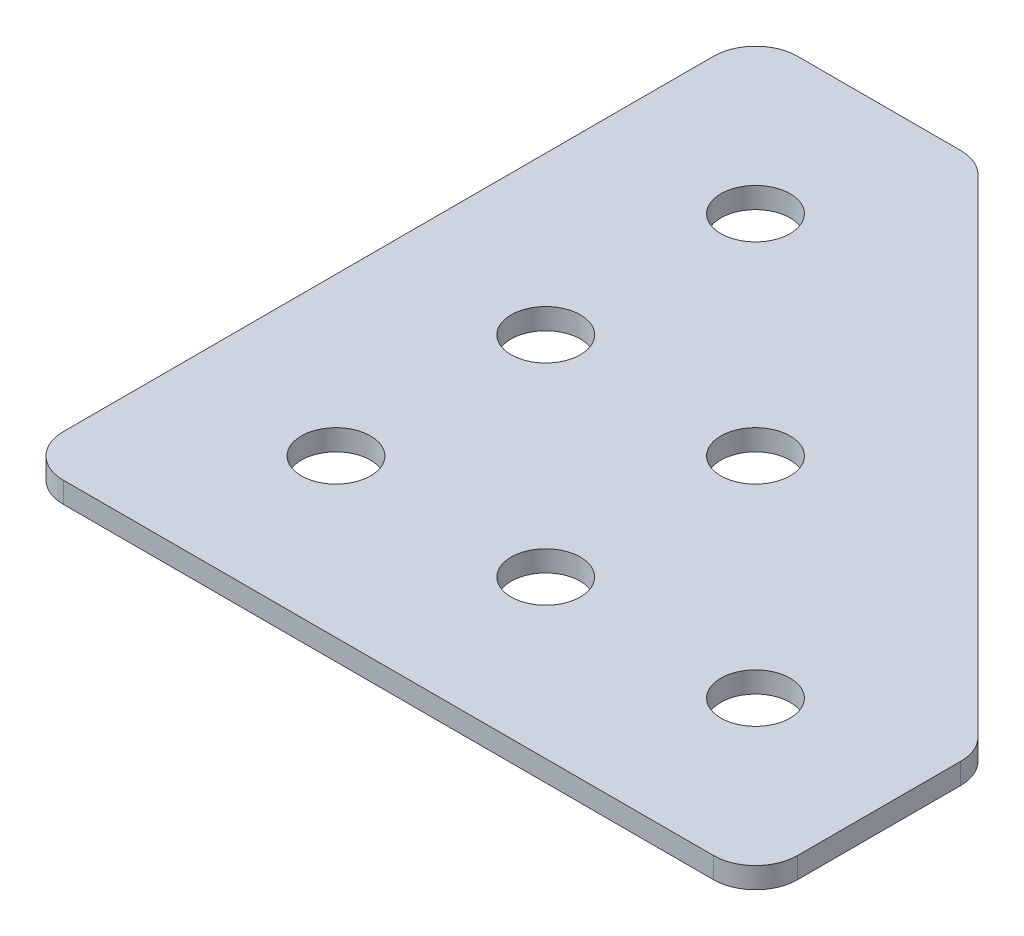
ISO-10303-21;
HEADER;
FILE_DESCRIPTION(('STEP AP214'),'2;1');
FILE_NAME('part.step','',(''),(''),'','','');
FILE_SCHEMA(('AUTOMOTIVE_DESIGN { 1 0 10303 214 1 1 1 1 }'));
ENDSEC;
DATA;
#1=APPLICATION_CONTEXT('core data for automotive mechanical design processes');
#2=APPLICATION_PROTOCOL_DEFINITION('international standard','automotive_design',2000,#1);
#3=PRODUCT_CONTEXT('',#1,'mechanical');
#4=PRODUCT('Part','Part','',(#3));
#5=PRODUCT_RELATED_PRODUCT_CATEGORY('part','',(#4));
#6=PRODUCT_DEFINITION_FORMATION('','',#4);
#7=PRODUCT_DEFINITION_CONTEXT('part definition',#1,'design');
#8=PRODUCT_DEFINITION('design','',#6,#7);
#9=PRODUCT_DEFINITION_SHAPE('','',#8);
#10=(LENGTH_UNIT() NAMED_UNIT(*) SI_UNIT(.MILLI.,.METRE.));
#11=(NAMED_UNIT(*) PLANE_ANGLE_UNIT() SI_UNIT($,.RADIAN.));
#12=(NAMED_UNIT(*) SI_UNIT($,.STERADIAN.) SOLID_ANGLE_UNIT());
#13=UNCERTAINTY_MEASURE_WITH_UNIT(LENGTH_MEASURE(1.E-05),#10,'distance_accuracy_value','');
#14=(GEOMETRIC_REPRESENTATION_CONTEXT(3) GLOBAL_UNCERTAINTY_ASSIGNED_CONTEXT((#13)) GLOBAL_UNIT_ASSIGNED_CONTEXT((#10,
#11,#12)) REPRESENTATION_CONTEXT('',''));
#15=CARTESIAN_POINT('',(0.,0.,0.));
#16=DIRECTION('',(0.,0.,1.));
#17=DIRECTION('',(1.,0.,0.));
#18=AXIS2_PLACEMENT_3D('',#15,#16,#17);
#19=CARTESIAN_POINT('',(33.,1.,-2.));
#20=DIRECTION('',(0.,1.,0.));
#21=DIRECTION('',(0.,0.,1.));
#22=AXIS2_PLACEMENT_3D('',#19,#20,#21);
#23=PLANE('',#22);
#24=CARTESIAN_POINT('',(7.5,1.,-17.5));
#25=DIRECTION('',(0.,1.,0.));
#26=DIRECTION('',(0.,0.,1.));
#27=AXIS2_PLACEMENT_3D('',#24,#25,#26);
#28=CIRCLE('',#27,1.65);
#29=CARTESIAN_POINT('',(7.5,1.,-15.85));
#30=VERTEX_POINT('',#29);
#31=EDGE_CURVE('E231',#30,#30,#28,.T.);
#32=ORIENTED_EDGE('',*,*,#31,.F.);
#33=EDGE_LOOP('',(#32));
#34=FACE_BOUND('',#33,.T.);
#35=CARTESIAN_POINT('',(17.5,1.,-7.5));
#36=DIRECTION('',(0.,1.,0.));
#37=DIRECTION('',(0.,0.,1.));
#38=AXIS2_PLACEMENT_3D('',#35,#36,#37);
#39=CIRCLE('',#38,1.65);
#40=CARTESIAN_POINT('',(17.5,1.,-5.85));
#41=VERTEX_POINT('',#40);
#42=EDGE_CURVE('E219',#41,#41,#39,.T.);
#43=ORIENTED_EDGE('',*,*,#42,.F.);
#44=EDGE_LOOP('',(#43));
#45=FACE_BOUND('',#44,.T.);
#46=CARTESIAN_POINT('',(7.5,1.,-7.49999999999999));
#47=DIRECTION('',(0.,1.,0.));
#48=DIRECTION('',(0.,0.,1.));
#49=AXIS2_PLACEMENT_3D('',#46,#47,#48);
#50=CIRCLE('',#49,1.65);
#51=CARTESIAN_POINT('',(7.5,1.,-5.84999999999999));
#52=VERTEX_POINT('',#51);
#53=EDGE_CURVE('E147',#52,#52,#50,.T.);
#54=ORIENTED_EDGE('',*,*,#53,.F.);
#55=EDGE_LOOP('',(#54));
#56=FACE_BOUND('',#55,.T.);
#57=CARTESIAN_POINT('',(33.,1.,-2.));
#58=DIRECTION('',(0.,1.,0.));
#59=DIRECTION('',(0.,0.,1.));
#60=AXIS2_PLACEMENT_3D('',#57,#58,#59);
#61=CIRCLE('',#60,2.);
#62=CARTESIAN_POINT('',(33.,1.,0.));
#63=VERTEX_POINT('',#62);
#64=CARTESIAN_POINT('',(35.,1.,-2.00000000000001));
#65=VERTEX_POINT('',#64);
#66=EDGE_CURVE('E162',#63,#65,#61,.T.);
#67=ORIENTED_EDGE('',*,*,#66,.T.);
#68=DIRECTION('',(0.,0.,-1.));
#69=VECTOR('',#68,1.);
#70=CARTESIAN_POINT('',(35.,1.,-9.77817459305201));
#71=LINE('',#70,#69);
#72=CARTESIAN_POINT('',(35.,1.,-9.77817459305201));
#73=VERTEX_POINT('',#72);
#74=EDGE_CURVE('E100',#65,#73,#71,.T.);
#75=ORIENTED_EDGE('',*,*,#74,.T.);
#76=CARTESIAN_POINT('',(33.,1.,-9.77817459305202));
#77=DIRECTION('',(0.,1.,0.));
#78=DIRECTION('',(0.,0.,1.));
#79=AXIS2_PLACEMENT_3D('',#76,#77,#78);
#80=CIRCLE('',#79,2.);
#81=CARTESIAN_POINT('',(34.4142135623731,1.,-11.1923881554251));
#82=VERTEX_POINT('',#81);
#83=EDGE_CURVE('E183',#73,#82,#80,.T.);
#84=ORIENTED_EDGE('',*,*,#83,.T.);
#85=DIRECTION('',(-0.707106781186548,0.,-0.707106781186547));
#86=VECTOR('',#85,1.);
#87=CARTESIAN_POINT('',(11.1923881554251,1.,-34.4142135623731));
#88=LINE('',#87,#86);
#89=CARTESIAN_POINT('',(11.1923881554251,1.,-34.4142135623731));
#90=VERTEX_POINT('',#89);
#91=EDGE_CURVE('E202',#82,#90,#88,.T.);
#92=ORIENTED_EDGE('',*,*,#91,.T.);
#93=CARTESIAN_POINT('',(9.77817459305202,1.,-33.));
#94=DIRECTION('',(0.,1.,0.));
#95=DIRECTION('',(0.,0.,-1.));
#96=AXIS2_PLACEMENT_3D('',#93,#94,#95);
#97=CIRCLE('',#96,2.);
#98=CARTESIAN_POINT('',(9.77817459305201,1.,-35.));
#99=VERTEX_POINT('',#98);
#100=EDGE_CURVE('E199',#90,#99,#97,.T.);
#101=ORIENTED_EDGE('',*,*,#100,.T.);
#102=DIRECTION('',(-1.,0.,0.));
#103=VECTOR('',#102,1.);
#104=CARTESIAN_POINT('',(2.00000000000001,1.,-35.));
#105=LINE('',#104,#103);
#106=CARTESIAN_POINT('',(2.,1.,-35.));
#107=VERTEX_POINT('',#106);
#108=EDGE_CURVE('E201',#99,#107,#105,.T.);
#109=ORIENTED_EDGE('',*,*,#108,.T.);
#110=CARTESIAN_POINT('',(2.,1.,-33.));
#111=DIRECTION('',(0.,1.,0.));
#112=DIRECTION('',(0.,0.,-1.));
#113=AXIS2_PLACEMENT_3D('',#110,#111,#112);
#114=CIRCLE('',#113,2.);
#115=CARTESIAN_POINT('',(0.,1.,-33.));
#116=VERTEX_POINT('',#115);
#117=EDGE_CURVE('E125',#107,#116,#114,.T.);
#118=ORIENTED_EDGE('',*,*,#117,.T.);
#119=DIRECTION('',(0.,0.,1.));
#120=VECTOR('',#119,1.);
#121=CARTESIAN_POINT('',(0.,1.,-2.));
#122=LINE('',#121,#120);
#123=CARTESIAN_POINT('',(0.,1.,-2.));
#124=VERTEX_POINT('',#123);
#125=EDGE_CURVE('E119',#116,#124,#122,.T.);
#126=ORIENTED_EDGE('',*,*,#125,.T.);
#127=CARTESIAN_POINT('',(2.,1.,-1.99999999999998));
#128=DIRECTION('',(0.,1.,0.));
#129=DIRECTION('',(0.,0.,1.));
#130=AXIS2_PLACEMENT_3D('',#127,#128,#129);
#131=CIRCLE('',#130,2.);
#132=CARTESIAN_POINT('',(2.,1.,0.));
#133=VERTEX_POINT('',#132);
#134=EDGE_CURVE('E123',#124,#133,#131,.T.);
#135=ORIENTED_EDGE('',*,*,#134,.T.);
#136=DIRECTION('',(1.,0.,0.));
#137=VECTOR('',#136,1.);
#138=CARTESIAN_POINT('',(33.,1.,0.));
#139=LINE('',#138,#137);
#140=EDGE_CURVE('E51',#133,#63,#139,.T.);
#141=ORIENTED_EDGE('',*,*,#140,.T.);
#142=EDGE_LOOP('',(#67,#75,#84,#92,#101,#109,#118,#126,#135,#141));
#143=FACE_BOUND('',#142,.T.);
#144=CARTESIAN_POINT('',(7.5,1.,-27.5));
#145=DIRECTION('',(0.,1.,0.));
#146=DIRECTION('',(0.,0.,1.));
#147=AXIS2_PLACEMENT_3D('',#144,#145,#146);
#148=CIRCLE('',#147,1.65);
#149=CARTESIAN_POINT('',(7.5,1.,-25.85));
#150=VERTEX_POINT('',#149);
#151=EDGE_CURVE('E213',#150,#150,#148,.T.);
#152=ORIENTED_EDGE('',*,*,#151,.F.);
#153=EDGE_LOOP('',(#152));
#154=FACE_BOUND('',#153,.T.);
#155=CARTESIAN_POINT('',(27.5,1.,-7.5));
#156=DIRECTION('',(0.,1.,0.));
#157=DIRECTION('',(0.,0.,1.));
#158=AXIS2_PLACEMENT_3D('',#155,#156,#157);
#159=CIRCLE('',#158,1.65);
#160=CARTESIAN_POINT('',(27.5,1.,-5.84999999999999));
#161=VERTEX_POINT('',#160);
#162=EDGE_CURVE('E225',#161,#161,#159,.T.);
#163=ORIENTED_EDGE('',*,*,#162,.F.);
#164=EDGE_LOOP('',(#163));
#165=FACE_BOUND('',#164,.T.);
#166=CARTESIAN_POINT('',(17.5,1.,-17.5));
#167=DIRECTION('',(0.,1.,0.));
#168=DIRECTION('',(0.,0.,1.));
#169=AXIS2_PLACEMENT_3D('',#166,#167,#168);
#170=CIRCLE('',#169,1.65);
#171=CARTESIAN_POINT('',(17.5,1.,-15.85));
#172=VERTEX_POINT('',#171);
#173=EDGE_CURVE('E237',#172,#172,#170,.T.);
#174=ORIENTED_EDGE('',*,*,#173,.F.);
#175=EDGE_LOOP('',(#174));
#176=FACE_BOUND('',#175,.T.);
#177=ADVANCED_FACE('F34',(#34,#45,#56,#143,#154,#165,#176),#23,.T.);
#178=CARTESIAN_POINT('',(33.,0.,-2.));
#179=DIRECTION('',(0.,1.,0.));
#180=DIRECTION('',(0.,0.,1.));
#181=AXIS2_PLACEMENT_3D('',#178,#179,#180);
#182=PLANE('',#181);
#183=CARTESIAN_POINT('',(33.,0.,-2.));
#184=DIRECTION('',(0.,1.,0.));
#185=DIRECTION('',(0.,0.,1.));
#186=AXIS2_PLACEMENT_3D('',#183,#184,#185);
#187=CIRCLE('',#186,2.);
#188=CARTESIAN_POINT('',(33.,0.,0.));
#189=VERTEX_POINT('',#188);
#190=CARTESIAN_POINT('',(35.,0.,-2.00000000000001));
#191=VERTEX_POINT('',#190);
#192=EDGE_CURVE('E143',#189,#191,#187,.T.);
#193=ORIENTED_EDGE('',*,*,#192,.F.);
#194=DIRECTION('',(1.,0.,0.));
#195=VECTOR('',#194,1.);
#196=CARTESIAN_POINT('',(33.,0.,0.));
#197=LINE('',#196,#195);
#198=CARTESIAN_POINT('',(2.,0.,0.));
#199=VERTEX_POINT('',#198);
#200=EDGE_CURVE('E92',#199,#189,#197,.T.);
#201=ORIENTED_EDGE('',*,*,#200,.F.);
#202=CARTESIAN_POINT('',(2.,0.,-1.99999999999998));
#203=DIRECTION('',(0.,1.,0.));
#204=DIRECTION('',(0.,0.,1.));
#205=AXIS2_PLACEMENT_3D('',#202,#203,#204);
#206=CIRCLE('',#205,2.);
#207=CARTESIAN_POINT('',(0.,0.,-2.));
#208=VERTEX_POINT('',#207);
#209=EDGE_CURVE('E86',#208,#199,#206,.T.);
#210=ORIENTED_EDGE('',*,*,#209,.F.);
#211=DIRECTION('',(0.,0.,1.));
#212=VECTOR('',#211,1.);
#213=CARTESIAN_POINT('',(0.,0.,-2.));
#214=LINE('',#213,#212);
#215=CARTESIAN_POINT('',(0.,0.,-33.));
#216=VERTEX_POINT('',#215);
#217=EDGE_CURVE('E133',#216,#208,#214,.T.);
#218=ORIENTED_EDGE('',*,*,#217,.F.);
#219=CARTESIAN_POINT('',(2.,0.,-33.));
#220=DIRECTION('',(0.,1.,0.));
#221=DIRECTION('',(0.,0.,-1.));
#222=AXIS2_PLACEMENT_3D('',#219,#220,#221);
#223=CIRCLE('',#222,2.);
#224=CARTESIAN_POINT('',(2.,0.,-35.));
#225=VERTEX_POINT('',#224);
#226=EDGE_CURVE('E157',#225,#216,#223,.T.);
#227=ORIENTED_EDGE('',*,*,#226,.F.);
#228=DIRECTION('',(-1.,0.,0.));
#229=VECTOR('',#228,1.);
#230=CARTESIAN_POINT('',(2.00000000000001,0.,-35.));
#231=LINE('',#230,#229);
#232=CARTESIAN_POINT('',(9.77817459305201,0.,-35.));
#233=VERTEX_POINT('',#232);
#234=EDGE_CURVE('E155',#233,#225,#231,.T.);
#235=ORIENTED_EDGE('',*,*,#234,.F.);
#236=CARTESIAN_POINT('',(9.77817459305202,0.,-33.));
#237=DIRECTION('',(0.,1.,0.));
#238=DIRECTION('',(0.,0.,-1.));
#239=AXIS2_PLACEMENT_3D('',#236,#237,#238);
#240=CIRCLE('',#239,2.);
#241=CARTESIAN_POINT('',(11.1923881554251,0.,-34.4142135623731));
#242=VERTEX_POINT('',#241);
#243=EDGE_CURVE('E153',#242,#233,#240,.T.);
#244=ORIENTED_EDGE('',*,*,#243,.F.);
#245=DIRECTION('',(-0.707106781186548,0.,-0.707106781186547));
#246=VECTOR('',#245,1.);
#247=CARTESIAN_POINT('',(11.1923881554251,0.,-34.4142135623731));
#248=LINE('',#247,#246);
#249=CARTESIAN_POINT('',(34.4142135623731,0.,-11.1923881554251));
#250=VERTEX_POINT('',#249);
#251=EDGE_CURVE('E151',#250,#242,#248,.T.);
#252=ORIENTED_EDGE('',*,*,#251,.F.);
#253=CARTESIAN_POINT('',(33.,0.,-9.77817459305202));
#254=DIRECTION('',(0.,1.,0.));
#255=DIRECTION('',(0.,0.,1.));
#256=AXIS2_PLACEMENT_3D('',#253,#254,#255);
#257=CIRCLE('',#256,2.);
#258=CARTESIAN_POINT('',(35.,0.,-9.77817459305201));
#259=VERTEX_POINT('',#258);
#260=EDGE_CURVE('E149',#259,#250,#257,.T.);
#261=ORIENTED_EDGE('',*,*,#260,.F.);
#262=DIRECTION('',(0.,0.,-1.));
#263=VECTOR('',#262,1.);
#264=CARTESIAN_POINT('',(35.,0.,-9.77817459305201));
#265=LINE('',#264,#263);
#266=EDGE_CURVE('E146',#191,#259,#265,.T.);
#267=ORIENTED_EDGE('',*,*,#266,.F.);
#268=EDGE_LOOP('',(#193,#201,#210,#218,#227,#235,#244,#252,#261,#267));
#269=FACE_BOUND('',#268,.T.);
#270=CARTESIAN_POINT('',(7.5,0.,-7.49999999999999));
#271=DIRECTION('',(0.,1.,0.));
#272=DIRECTION('',(0.,0.,1.));
#273=AXIS2_PLACEMENT_3D('',#270,#271,#272);
#274=CIRCLE('',#273,1.65);
#275=CARTESIAN_POINT('',(7.5,0.,-5.84999999999999));
#276=VERTEX_POINT('',#275);
#277=EDGE_CURVE('E210',#276,#276,#274,.T.);
#278=ORIENTED_EDGE('',*,*,#277,.T.);
#279=EDGE_LOOP('',(#278));
#280=FACE_BOUND('',#279,.T.);
#281=CARTESIAN_POINT('',(7.5,0.,-27.5));
#282=DIRECTION('',(0.,1.,0.));
#283=DIRECTION('',(0.,0.,1.));
#284=AXIS2_PLACEMENT_3D('',#281,#282,#283);
#285=CIRCLE('',#284,1.65);
#286=CARTESIAN_POINT('',(7.5,0.,-25.85));
#287=VERTEX_POINT('',#286);
#288=EDGE_CURVE('E216',#287,#287,#285,.T.);
#289=ORIENTED_EDGE('',*,*,#288,.T.);
#290=EDGE_LOOP('',(#289));
#291=FACE_BOUND('',#290,.T.);
#292=CARTESIAN_POINT('',(17.5,0.,-7.5));
#293=DIRECTION('',(0.,1.,0.));
#294=DIRECTION('',(0.,0.,1.));
#295=AXIS2_PLACEMENT_3D('',#292,#293,#294);
#296=CIRCLE('',#295,1.65);
#297=CARTESIAN_POINT('',(17.5,0.,-5.85));
#298=VERTEX_POINT('',#297);
#299=EDGE_CURVE('E222',#298,#298,#296,.T.);
#300=ORIENTED_EDGE('',*,*,#299,.T.);
#301=EDGE_LOOP('',(#300));
#302=FACE_BOUND('',#301,.T.);
#303=CARTESIAN_POINT('',(27.5,0.,-7.5));
#304=DIRECTION('',(0.,1.,0.));
#305=DIRECTION('',(0.,0.,1.));
#306=AXIS2_PLACEMENT_3D('',#303,#304,#305);
#307=CIRCLE('',#306,1.65);
#308=CARTESIAN_POINT('',(27.5,0.,-5.84999999999999));
#309=VERTEX_POINT('',#308);
#310=EDGE_CURVE('E228',#309,#309,#307,.T.);
#311=ORIENTED_EDGE('',*,*,#310,.T.);
#312=EDGE_LOOP('',(#311));
#313=FACE_BOUND('',#312,.T.);
#314=CARTESIAN_POINT('',(7.5,0.,-17.5));
#315=DIRECTION('',(0.,1.,0.));
#316=DIRECTION('',(0.,0.,1.));
#317=AXIS2_PLACEMENT_3D('',#314,#315,#316);
#318=CIRCLE('',#317,1.65);
#319=CARTESIAN_POINT('',(7.5,0.,-15.85));
#320=VERTEX_POINT('',#319);
#321=EDGE_CURVE('E234',#320,#320,#318,.T.);
#322=ORIENTED_EDGE('',*,*,#321,.T.);
#323=EDGE_LOOP('',(#322));
#324=FACE_BOUND('',#323,.T.);
#325=CARTESIAN_POINT('',(17.5,0.,-17.5));
#326=DIRECTION('',(0.,1.,0.));
#327=DIRECTION('',(0.,0.,1.));
#328=AXIS2_PLACEMENT_3D('',#325,#326,#327);
#329=CIRCLE('',#328,1.65);
#330=CARTESIAN_POINT('',(17.5,0.,-15.85));
#331=VERTEX_POINT('',#330);
#332=EDGE_CURVE('E240',#331,#331,#329,.T.);
#333=ORIENTED_EDGE('',*,*,#332,.T.);
#334=EDGE_LOOP('',(#333));
#335=FACE_BOUND('',#334,.T.);
#336=ADVANCED_FACE('F187',(#269,#280,#291,#302,#313,#324,#335),#182,.F.);
#337=CARTESIAN_POINT('',(33.,1.,-2.));
#338=DIRECTION('',(0.,-1.,0.));
#339=DIRECTION('',(0.,0.,-1.));
#340=AXIS2_PLACEMENT_3D('',#337,#338,#339);
#341=CYLINDRICAL_SURFACE('',#340,2.);
#342=ORIENTED_EDGE('',*,*,#192,.T.);
#343=DIRECTION('',(0.,-1.,0.));
#344=VECTOR('',#343,1.);
#345=CARTESIAN_POINT('',(35.,1.,-2.00000000000001));
#346=LINE('',#345,#344);
#347=EDGE_CURVE('E11',#65,#191,#346,.T.);
#348=ORIENTED_EDGE('',*,*,#347,.F.);
#349=ORIENTED_EDGE('',*,*,#66,.F.);
#350=DIRECTION('',(0.,-1.,0.));
#351=VECTOR('',#350,1.);
#352=CARTESIAN_POINT('',(33.,1.,0.));
#353=LINE('',#352,#351);
#354=EDGE_CURVE('E139',#63,#189,#353,.T.);
#355=ORIENTED_EDGE('',*,*,#354,.T.);
#356=EDGE_LOOP('',(#342,#348,#349,#355));
#357=FACE_BOUND('',#356,.T.);
#358=ADVANCED_FACE('F36',(#357),#341,.T.);
#359=CARTESIAN_POINT('',(35.,1.,-9.77817459305201));
#360=DIRECTION('',(-1.,0.,0.));
#361=DIRECTION('',(0.,0.,1.));
#362=AXIS2_PLACEMENT_3D('',#359,#360,#361);
#363=PLANE('',#362);
#364=ORIENTED_EDGE('',*,*,#266,.T.);
#365=DIRECTION('',(0.,-1.,0.));
#366=VECTOR('',#365,1.);
#367=CARTESIAN_POINT('',(35.,1.,-9.77817459305201));
#368=LINE('',#367,#366);
#369=EDGE_CURVE('E43',#73,#259,#368,.T.);
#370=ORIENTED_EDGE('',*,*,#369,.F.);
#371=ORIENTED_EDGE('',*,*,#74,.F.);
#372=ORIENTED_EDGE('',*,*,#347,.T.);
#373=EDGE_LOOP('',(#364,#370,#371,#372));
#374=FACE_BOUND('',#373,.T.);
#375=ADVANCED_FACE('F282',(#374),#363,.F.);
#376=CARTESIAN_POINT('',(33.,1.,-9.77817459305202));
#377=DIRECTION('',(0.,-1.,0.));
#378=DIRECTION('',(0.,0.,-1.));
#379=AXIS2_PLACEMENT_3D('',#376,#377,#378);
#380=CYLINDRICAL_SURFACE('',#379,2.);
#381=ORIENTED_EDGE('',*,*,#260,.T.);
#382=DIRECTION('',(0.,-1.,0.));
#383=VECTOR('',#382,1.);
#384=CARTESIAN_POINT('',(34.4142135623731,1.,-11.1923881554251));
#385=LINE('',#384,#383);
#386=EDGE_CURVE('E175',#82,#250,#385,.T.);
#387=ORIENTED_EDGE('',*,*,#386,.F.);
#388=ORIENTED_EDGE('',*,*,#83,.F.);
#389=ORIENTED_EDGE('',*,*,#369,.T.);
#390=EDGE_LOOP('',(#381,#387,#388,#389));
#391=FACE_BOUND('',#390,.T.);
#392=ADVANCED_FACE('F181',(#391),#380,.T.);
#393=CARTESIAN_POINT('',(11.1923881554251,1.,-34.4142135623731));
#394=DIRECTION('',(-0.707106781186547,0.,0.707106781186548));
#395=DIRECTION('',(0.707106781186548,0.,0.707106781186547));
#396=AXIS2_PLACEMENT_3D('',#393,#394,#395);
#397=PLANE('',#396);
#398=ORIENTED_EDGE('',*,*,#251,.T.);
#399=DIRECTION('',(0.,-1.,0.));
#400=VECTOR('',#399,1.);
#401=CARTESIAN_POINT('',(11.1923881554251,1.,-34.4142135623731));
#402=LINE('',#401,#400);
#403=EDGE_CURVE('E172',#90,#242,#402,.T.);
#404=ORIENTED_EDGE('',*,*,#403,.F.);
#405=ORIENTED_EDGE('',*,*,#91,.F.);
#406=ORIENTED_EDGE('',*,*,#386,.T.);
#407=EDGE_LOOP('',(#398,#404,#405,#406));
#408=FACE_BOUND('',#407,.T.);
#409=ADVANCED_FACE('F193',(#408),#397,.F.);
#410=CARTESIAN_POINT('',(9.77817459305202,1.,-33.));
#411=DIRECTION('',(0.,-1.,0.));
#412=DIRECTION('',(0.,0.,-1.));
#413=AXIS2_PLACEMENT_3D('',#410,#411,#412);
#414=CYLINDRICAL_SURFACE('',#413,2.);
#415=ORIENTED_EDGE('',*,*,#243,.T.);
#416=DIRECTION('',(0.,-1.,0.));
#417=VECTOR('',#416,1.);
#418=CARTESIAN_POINT('',(9.77817459305201,1.,-35.));
#419=LINE('',#418,#417);
#420=EDGE_CURVE('E169',#99,#233,#419,.T.);
#421=ORIENTED_EDGE('',*,*,#420,.F.);
#422=ORIENTED_EDGE('',*,*,#100,.F.);
#423=ORIENTED_EDGE('',*,*,#403,.T.);
#424=EDGE_LOOP('',(#415,#421,#422,#423));
#425=FACE_BOUND('',#424,.T.);
#426=ADVANCED_FACE('F197',(#425),#414,.T.);
#427=CARTESIAN_POINT('',(2.00000000000001,1.,-35.));
#428=DIRECTION('',(0.,0.,1.));
#429=DIRECTION('',(1.,0.,0.));
#430=AXIS2_PLACEMENT_3D('',#427,#428,#429);
#431=PLANE('',#430);
#432=ORIENTED_EDGE('',*,*,#234,.T.);
#433=DIRECTION('',(0.,-1.,0.));
#434=VECTOR('',#433,1.);
#435=CARTESIAN_POINT('',(2.,1.,-35.));
#436=LINE('',#435,#434);
#437=EDGE_CURVE('E166',#107,#225,#436,.T.);
#438=ORIENTED_EDGE('',*,*,#437,.F.);
#439=ORIENTED_EDGE('',*,*,#108,.F.);
#440=ORIENTED_EDGE('',*,*,#420,.T.);
#441=EDGE_LOOP('',(#432,#438,#439,#440));
#442=FACE_BOUND('',#441,.T.);
#443=ADVANCED_FACE('F272',(#442),#431,.F.);
#444=CARTESIAN_POINT('',(2.,1.,-33.));
#445=DIRECTION('',(0.,-1.,0.));
#446=DIRECTION('',(0.,0.,-1.));
#447=AXIS2_PLACEMENT_3D('',#444,#445,#446);
#448=CYLINDRICAL_SURFACE('',#447,2.);
#449=ORIENTED_EDGE('',*,*,#226,.T.);
#450=DIRECTION('',(0.,-1.,0.));
#451=VECTOR('',#450,1.);
#452=CARTESIAN_POINT('',(0.,1.,-33.));
#453=LINE('',#452,#451);
#454=EDGE_CURVE('E134',#116,#216,#453,.T.);
#455=ORIENTED_EDGE('',*,*,#454,.F.);
#456=ORIENTED_EDGE('',*,*,#117,.F.);
#457=ORIENTED_EDGE('',*,*,#437,.T.);
#458=EDGE_LOOP('',(#449,#455,#456,#457));
#459=FACE_BOUND('',#458,.T.);
#460=ADVANCED_FACE('F269',(#459),#448,.T.);
#461=CARTESIAN_POINT('',(0.,1.,-2.));
#462=DIRECTION('',(1.,0.,0.));
#463=DIRECTION('',(0.,0.,-1.));
#464=AXIS2_PLACEMENT_3D('',#461,#462,#463);
#465=PLANE('',#464);
#466=ORIENTED_EDGE('',*,*,#217,.T.);
#467=DIRECTION('',(0.,-1.,0.));
#468=VECTOR('',#467,1.);
#469=CARTESIAN_POINT('',(0.,1.,-2.));
#470=LINE('',#469,#468);
#471=EDGE_CURVE('E130',#124,#208,#470,.T.);
#472=ORIENTED_EDGE('',*,*,#471,.F.);
#473=ORIENTED_EDGE('',*,*,#125,.F.);
#474=ORIENTED_EDGE('',*,*,#454,.T.);
#475=EDGE_LOOP('',(#466,#472,#473,#474));
#476=FACE_BOUND('',#475,.T.);
#477=ADVANCED_FACE('F131',(#476),#465,.F.);
#478=CARTESIAN_POINT('',(2.,1.,-1.99999999999998));
#479=DIRECTION('',(0.,-1.,0.));
#480=DIRECTION('',(0.,0.,-1.));
#481=AXIS2_PLACEMENT_3D('',#478,#479,#480);
#482=CYLINDRICAL_SURFACE('',#481,2.);
#483=ORIENTED_EDGE('',*,*,#209,.T.);
#484=DIRECTION('',(0.,-1.,0.));
#485=VECTOR('',#484,1.);
#486=CARTESIAN_POINT('',(2.,1.,0.));
#487=LINE('',#486,#485);
#488=EDGE_CURVE('E135',#133,#199,#487,.T.);
#489=ORIENTED_EDGE('',*,*,#488,.F.);
#490=ORIENTED_EDGE('',*,*,#134,.F.);
#491=ORIENTED_EDGE('',*,*,#471,.T.);
#492=EDGE_LOOP('',(#483,#489,#490,#491));
#493=FACE_BOUND('',#492,.T.);
#494=ADVANCED_FACE('F137',(#493),#482,.T.);
#495=CARTESIAN_POINT('',(33.,1.,0.));
#496=DIRECTION('',(0.,0.,-1.));
#497=DIRECTION('',(-1.,0.,0.));
#498=AXIS2_PLACEMENT_3D('',#495,#496,#497);
#499=PLANE('',#498);
#500=ORIENTED_EDGE('',*,*,#200,.T.);
#501=ORIENTED_EDGE('',*,*,#354,.F.);
#502=ORIENTED_EDGE('',*,*,#140,.F.);
#503=ORIENTED_EDGE('',*,*,#488,.T.);
#504=EDGE_LOOP('',(#500,#501,#502,#503));
#505=FACE_BOUND('',#504,.T.);
#506=ADVANCED_FACE('F262',(#505),#499,.F.);
#507=CARTESIAN_POINT('',(7.5,1.,-7.49999999999999));
#508=DIRECTION('',(0.,-1.,0.));
#509=DIRECTION('',(0.,0.,-1.));
#510=AXIS2_PLACEMENT_3D('',#507,#508,#509);
#511=CYLINDRICAL_SURFACE('',#510,1.65);
#512=ORIENTED_EDGE('',*,*,#53,.T.);
#513=EDGE_LOOP('',(#512));
#514=FACE_BOUND('',#513,.T.);
#515=ORIENTED_EDGE('',*,*,#277,.F.);
#516=EDGE_LOOP('',(#515));
#517=FACE_BOUND('',#516,.T.);
#518=ADVANCED_FACE('F259',(#514,#517),#511,.F.);
#519=CARTESIAN_POINT('',(7.5,1.,-27.5));
#520=DIRECTION('',(0.,-1.,0.));
#521=DIRECTION('',(0.,0.,-1.));
#522=AXIS2_PLACEMENT_3D('',#519,#520,#521);
#523=CYLINDRICAL_SURFACE('',#522,1.65);
#524=ORIENTED_EDGE('',*,*,#151,.T.);
#525=EDGE_LOOP('',(#524));
#526=FACE_BOUND('',#525,.T.);
#527=ORIENTED_EDGE('',*,*,#288,.F.);
#528=EDGE_LOOP('',(#527));
#529=FACE_BOUND('',#528,.T.);
#530=ADVANCED_FACE('F358',(#526,#529),#523,.F.);
#531=CARTESIAN_POINT('',(17.5,1.,-7.5));
#532=DIRECTION('',(0.,-1.,0.));
#533=DIRECTION('',(0.,0.,-1.));
#534=AXIS2_PLACEMENT_3D('',#531,#532,#533);
#535=CYLINDRICAL_SURFACE('',#534,1.65);
#536=ORIENTED_EDGE('',*,*,#42,.T.);
#537=EDGE_LOOP('',(#536));
#538=FACE_BOUND('',#537,.T.);
#539=ORIENTED_EDGE('',*,*,#299,.F.);
#540=EDGE_LOOP('',(#539));
#541=FACE_BOUND('',#540,.T.);
#542=ADVANCED_FACE('F366',(#538,#541),#535,.F.);
#543=CARTESIAN_POINT('',(27.5,1.,-7.5));
#544=DIRECTION('',(0.,-1.,0.));
#545=DIRECTION('',(0.,0.,-1.));
#546=AXIS2_PLACEMENT_3D('',#543,#544,#545);
#547=CYLINDRICAL_SURFACE('',#546,1.65);
#548=ORIENTED_EDGE('',*,*,#162,.T.);
#549=EDGE_LOOP('',(#548));
#550=FACE_BOUND('',#549,.T.);
#551=ORIENTED_EDGE('',*,*,#310,.F.);
#552=EDGE_LOOP('',(#551));
#553=FACE_BOUND('',#552,.T.);
#554=ADVANCED_FACE('F374',(#550,#553),#547,.F.);
#555=CARTESIAN_POINT('',(7.5,1.,-17.5));
#556=DIRECTION('',(0.,-1.,0.));
#557=DIRECTION('',(0.,0.,-1.));
#558=AXIS2_PLACEMENT_3D('',#555,#556,#557);
#559=CYLINDRICAL_SURFACE('',#558,1.65);
#560=ORIENTED_EDGE('',*,*,#31,.T.);
#561=EDGE_LOOP('',(#560));
#562=FACE_BOUND('',#561,.T.);
#563=ORIENTED_EDGE('',*,*,#321,.F.);
#564=EDGE_LOOP('',(#563));
#565=FACE_BOUND('',#564,.T.);
#566=ADVANCED_FACE('F383',(#562,#565),#559,.F.);
#567=CARTESIAN_POINT('',(17.5,1.,-17.5));
#568=DIRECTION('',(0.,-1.,0.));
#569=DIRECTION('',(0.,0.,-1.));
#570=AXIS2_PLACEMENT_3D('',#567,#568,#569);
#571=CYLINDRICAL_SURFACE('',#570,1.65);
#572=ORIENTED_EDGE('',*,*,#173,.T.);
#573=EDGE_LOOP('',(#572));
#574=FACE_BOUND('',#573,.T.);
#575=ORIENTED_EDGE('',*,*,#332,.F.);
#576=EDGE_LOOP('',(#575));
#577=FACE_BOUND('',#576,.T.);
#578=ADVANCED_FACE('F246',(#574,#577),#571,.F.);
#579=CLOSED_SHELL('',(#177,#336,#358,#375,#392,#409,#426,#443,#460,#477,#494,#506,#518,#530,
#542,#554,#566,#578));
#580=MANIFOLD_SOLID_BREP('B2',#579);
#581=ADVANCED_BREP_SHAPE_REPRESENTATION('',(#18,#580),#14);
#582=SHAPE_DEFINITION_REPRESENTATION(#9,#581);
ENDSEC;
END-ISO-10303-21;
